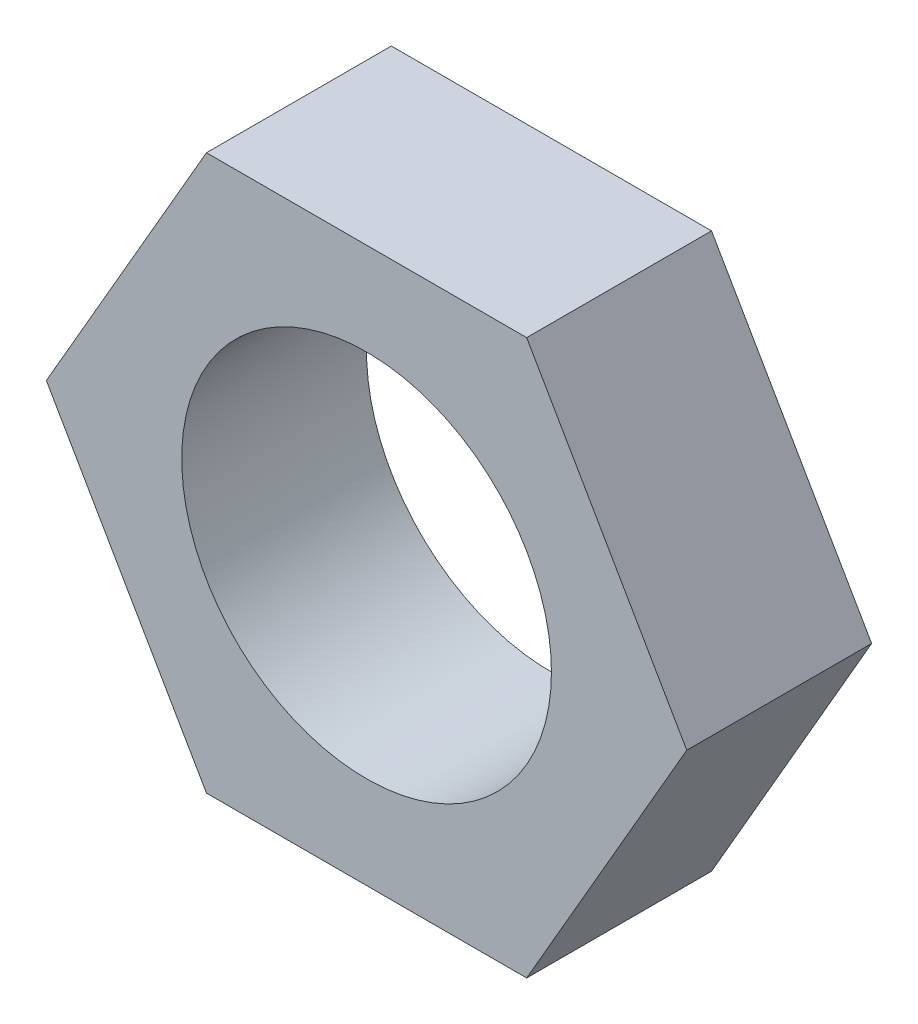
ISO-10303-21;
HEADER;
FILE_DESCRIPTION(('STEP AP214'),'2;1');
FILE_NAME('part.step','',(''),(''),'','','');
FILE_SCHEMA(('AUTOMOTIVE_DESIGN { 1 0 10303 214 1 1 1 1 }'));
ENDSEC;
DATA;
#1=APPLICATION_CONTEXT('core data for automotive mechanical design processes');
#2=APPLICATION_PROTOCOL_DEFINITION('international standard','automotive_design',2000,#1);
#3=PRODUCT_CONTEXT('',#1,'mechanical');
#4=PRODUCT('Part','Part','',(#3));
#5=PRODUCT_RELATED_PRODUCT_CATEGORY('part','',(#4));
#6=PRODUCT_DEFINITION_FORMATION('','',#4);
#7=PRODUCT_DEFINITION_CONTEXT('part definition',#1,'design');
#8=PRODUCT_DEFINITION('design','',#6,#7);
#9=PRODUCT_DEFINITION_SHAPE('','',#8);
#10=(LENGTH_UNIT() NAMED_UNIT(*) SI_UNIT(.MILLI.,.METRE.));
#11=(NAMED_UNIT(*) PLANE_ANGLE_UNIT() SI_UNIT($,.RADIAN.));
#12=(NAMED_UNIT(*) SI_UNIT($,.STERADIAN.) SOLID_ANGLE_UNIT());
#13=UNCERTAINTY_MEASURE_WITH_UNIT(LENGTH_MEASURE(1.E-05),#10,'distance_accuracy_value','');
#14=(GEOMETRIC_REPRESENTATION_CONTEXT(3) GLOBAL_UNCERTAINTY_ASSIGNED_CONTEXT((#13)) GLOBAL_UNIT_ASSIGNED_CONTEXT((#10,
#11,#12)) REPRESENTATION_CONTEXT('',''));
#15=CARTESIAN_POINT('',(0.,0.,0.));
#16=DIRECTION('',(0.,0.,1.));
#17=DIRECTION('',(1.,0.,0.));
#18=AXIS2_PLACEMENT_3D('',#15,#16,#17);
#19=CARTESIAN_POINT('',(-4.3301270189222,-7.5,5.));
#20=DIRECTION('',(0.,1.,0.));
#21=DIRECTION('',(0.,0.,1.));
#22=AXIS2_PLACEMENT_3D('',#19,#20,#21);
#23=PLANE('',#22);
#24=DIRECTION('',(1.,0.,0.));
#25=VECTOR('',#24,1.);
#26=CARTESIAN_POINT('',(-4.3301270189222,-7.5,0.));
#27=LINE('',#26,#25);
#28=CARTESIAN_POINT('',(-4.3301270189222,-7.5,0.));
#29=VERTEX_POINT('',#28);
#30=CARTESIAN_POINT('',(4.33012701892218,-7.5,0.));
#31=VERTEX_POINT('',#30);
#32=EDGE_CURVE('E118',#29,#31,#27,.T.);
#33=ORIENTED_EDGE('',*,*,#32,.T.);
#34=DIRECTION('',(0.,0.,-1.));
#35=VECTOR('',#34,1.);
#36=CARTESIAN_POINT('',(4.33012701892218,-7.5,5.));
#37=LINE('',#36,#35);
#38=CARTESIAN_POINT('',(4.33012701892218,-7.5,5.));
#39=VERTEX_POINT('',#38);
#40=EDGE_CURVE('E11',#39,#31,#37,.T.);
#41=ORIENTED_EDGE('',*,*,#40,.F.);
#42=DIRECTION('',(1.,0.,0.));
#43=VECTOR('',#42,1.);
#44=CARTESIAN_POINT('',(-4.3301270189222,-7.5,5.));
#45=LINE('',#44,#43);
#46=CARTESIAN_POINT('',(-4.3301270189222,-7.5,5.));
#47=VERTEX_POINT('',#46);
#48=EDGE_CURVE('E129',#47,#39,#45,.T.);
#49=ORIENTED_EDGE('',*,*,#48,.F.);
#50=DIRECTION('',(0.,0.,-1.));
#51=VECTOR('',#50,1.);
#52=CARTESIAN_POINT('',(-4.3301270189222,-7.5,5.));
#53=LINE('',#52,#51);
#54=EDGE_CURVE('E114',#47,#29,#53,.T.);
#55=ORIENTED_EDGE('',*,*,#54,.T.);
#56=EDGE_LOOP('',(#33,#41,#49,#55));
#57=FACE_BOUND('',#56,.T.);
#58=ADVANCED_FACE('F34',(#57),#23,.F.);
#59=CARTESIAN_POINT('',(4.33012701892218,-7.5,5.));
#60=DIRECTION('',(-0.866025403784438,0.5,0.));
#61=DIRECTION('',(-0.5,-0.866025403784438,0.));
#62=AXIS2_PLACEMENT_3D('',#59,#60,#61);
#63=PLANE('',#62);
#64=DIRECTION('',(0.5,0.866025403784438,0.));
#65=VECTOR('',#64,1.);
#66=CARTESIAN_POINT('',(4.33012701892218,-7.5,0.));
#67=LINE('',#66,#65);
#68=CARTESIAN_POINT('',(8.66025403784437,0.,0.));
#69=VERTEX_POINT('',#68);
#70=EDGE_CURVE('E121',#31,#69,#67,.T.);
#71=ORIENTED_EDGE('',*,*,#70,.T.);
#72=DIRECTION('',(0.,0.,-1.));
#73=VECTOR('',#72,1.);
#74=CARTESIAN_POINT('',(8.66025403784437,0.,5.));
#75=LINE('',#74,#73);
#76=CARTESIAN_POINT('',(8.66025403784437,0.,5.));
#77=VERTEX_POINT('',#76);
#78=EDGE_CURVE('E42',#77,#69,#75,.T.);
#79=ORIENTED_EDGE('',*,*,#78,.F.);
#80=DIRECTION('',(0.5,0.866025403784438,0.));
#81=VECTOR('',#80,1.);
#82=CARTESIAN_POINT('',(4.33012701892218,-7.5,5.));
#83=LINE('',#82,#81);
#84=EDGE_CURVE('E87',#39,#77,#83,.T.);
#85=ORIENTED_EDGE('',*,*,#84,.F.);
#86=ORIENTED_EDGE('',*,*,#40,.T.);
#87=EDGE_LOOP('',(#71,#79,#85,#86));
#88=FACE_BOUND('',#87,.T.);
#89=ADVANCED_FACE('F154',(#88),#63,.F.);
#90=CARTESIAN_POINT('',(8.66025403784437,0.,5.));
#91=DIRECTION('',(-0.866025403784438,-0.500000000000001,0.));
#92=DIRECTION('',(0.500000000000001,-0.866025403784438,0.));
#93=AXIS2_PLACEMENT_3D('',#90,#91,#92);
#94=PLANE('',#93);
#95=DIRECTION('',(-0.500000000000001,0.866025403784438,0.));
#96=VECTOR('',#95,1.);
#97=CARTESIAN_POINT('',(8.66025403784437,0.,0.));
#98=LINE('',#97,#96);
#99=CARTESIAN_POINT('',(4.33012701892217,7.50000000000001,0.));
#100=VERTEX_POINT('',#99);
#101=EDGE_CURVE('E124',#69,#100,#98,.T.);
#102=ORIENTED_EDGE('',*,*,#101,.T.);
#103=DIRECTION('',(0.,0.,-1.));
#104=VECTOR('',#103,1.);
#105=CARTESIAN_POINT('',(4.33012701892217,7.50000000000001,5.));
#106=LINE('',#105,#104);
#107=CARTESIAN_POINT('',(4.33012701892217,7.50000000000001,5.));
#108=VERTEX_POINT('',#107);
#109=EDGE_CURVE('E109',#108,#100,#106,.T.);
#110=ORIENTED_EDGE('',*,*,#109,.F.);
#111=DIRECTION('',(-0.500000000000001,0.866025403784438,0.));
#112=VECTOR('',#111,1.);
#113=CARTESIAN_POINT('',(8.66025403784437,0.,5.));
#114=LINE('',#113,#112);
#115=EDGE_CURVE('E100',#77,#108,#114,.T.);
#116=ORIENTED_EDGE('',*,*,#115,.F.);
#117=ORIENTED_EDGE('',*,*,#78,.T.);
#118=EDGE_LOOP('',(#102,#110,#116,#117));
#119=FACE_BOUND('',#118,.T.);
#120=ADVANCED_FACE('F135',(#119),#94,.F.);
#121=CARTESIAN_POINT('',(4.33012701892217,7.50000000000001,5.));
#122=DIRECTION('',(0.,-1.,0.));
#123=DIRECTION('',(0.,0.,-1.));
#124=AXIS2_PLACEMENT_3D('',#121,#122,#123);
#125=PLANE('',#124);
#126=DIRECTION('',(-1.,0.,0.));
#127=VECTOR('',#126,1.);
#128=CARTESIAN_POINT('',(4.33012701892217,7.50000000000001,0.));
#129=LINE('',#128,#127);
#130=CARTESIAN_POINT('',(-4.3301270189222,7.50000000000001,0.));
#131=VERTEX_POINT('',#130);
#132=EDGE_CURVE('E108',#100,#131,#129,.T.);
#133=ORIENTED_EDGE('',*,*,#132,.T.);
#134=DIRECTION('',(0.,0.,-1.));
#135=VECTOR('',#134,1.);
#136=CARTESIAN_POINT('',(-4.3301270189222,7.50000000000001,5.));
#137=LINE('',#136,#135);
#138=CARTESIAN_POINT('',(-4.3301270189222,7.50000000000001,5.));
#139=VERTEX_POINT('',#138);
#140=EDGE_CURVE('E105',#139,#131,#137,.T.);
#141=ORIENTED_EDGE('',*,*,#140,.F.);
#142=DIRECTION('',(-1.,0.,0.));
#143=VECTOR('',#142,1.);
#144=CARTESIAN_POINT('',(4.33012701892217,7.50000000000001,5.));
#145=LINE('',#144,#143);
#146=EDGE_CURVE('E94',#108,#139,#145,.T.);
#147=ORIENTED_EDGE('',*,*,#146,.F.);
#148=ORIENTED_EDGE('',*,*,#109,.T.);
#149=EDGE_LOOP('',(#133,#141,#147,#148));
#150=FACE_BOUND('',#149,.T.);
#151=ADVANCED_FACE('F106',(#150),#125,.F.);
#152=CARTESIAN_POINT('',(-4.3301270189222,7.50000000000001,5.));
#153=DIRECTION('',(0.866025403784438,-0.5,0.));
#154=DIRECTION('',(0.5,0.866025403784439,0.));
#155=AXIS2_PLACEMENT_3D('',#152,#153,#154);
#156=PLANE('',#155);
#157=DIRECTION('',(-0.5,-0.866025403784439,0.));
#158=VECTOR('',#157,1.);
#159=CARTESIAN_POINT('',(-4.3301270189222,7.50000000000001,0.));
#160=LINE('',#159,#158);
#161=CARTESIAN_POINT('',(-8.6602540378444,0.,0.));
#162=VERTEX_POINT('',#161);
#163=EDGE_CURVE('E73',#131,#162,#160,.T.);
#164=ORIENTED_EDGE('',*,*,#163,.T.);
#165=DIRECTION('',(0.,0.,-1.));
#166=VECTOR('',#165,1.);
#167=CARTESIAN_POINT('',(-8.6602540378444,0.,5.));
#168=LINE('',#167,#166);
#169=CARTESIAN_POINT('',(-8.6602540378444,0.,5.));
#170=VERTEX_POINT('',#169);
#171=EDGE_CURVE('E110',#170,#162,#168,.T.);
#172=ORIENTED_EDGE('',*,*,#171,.F.);
#173=DIRECTION('',(-0.5,-0.866025403784439,0.));
#174=VECTOR('',#173,1.);
#175=CARTESIAN_POINT('',(-4.3301270189222,7.50000000000001,5.));
#176=LINE('',#175,#174);
#177=EDGE_CURVE('E98',#139,#170,#176,.T.);
#178=ORIENTED_EDGE('',*,*,#177,.F.);
#179=ORIENTED_EDGE('',*,*,#140,.T.);
#180=EDGE_LOOP('',(#164,#172,#178,#179));
#181=FACE_BOUND('',#180,.T.);
#182=ADVANCED_FACE('F112',(#181),#156,.F.);
#183=CARTESIAN_POINT('',(-8.6602540378444,0.,5.));
#184=DIRECTION('',(0.866025403784438,0.5,0.));
#185=DIRECTION('',(-0.5,0.866025403784438,0.));
#186=AXIS2_PLACEMENT_3D('',#183,#184,#185);
#187=PLANE('',#186);
#188=DIRECTION('',(0.5,-0.866025403784439,0.));
#189=VECTOR('',#188,1.);
#190=CARTESIAN_POINT('',(-8.6602540378444,0.,0.));
#191=LINE('',#190,#189);
#192=EDGE_CURVE('E79',#162,#29,#191,.T.);
#193=ORIENTED_EDGE('',*,*,#192,.T.);
#194=ORIENTED_EDGE('',*,*,#54,.F.);
#195=DIRECTION('',(0.5,-0.866025403784439,0.));
#196=VECTOR('',#195,1.);
#197=CARTESIAN_POINT('',(-8.6602540378444,0.,5.));
#198=LINE('',#197,#196);
#199=EDGE_CURVE('E50',#170,#47,#198,.T.);
#200=ORIENTED_EDGE('',*,*,#199,.F.);
#201=ORIENTED_EDGE('',*,*,#171,.T.);
#202=EDGE_LOOP('',(#193,#194,#200,#201));
#203=FACE_BOUND('',#202,.T.);
#204=ADVANCED_FACE('F142',(#203),#187,.F.);
#205=CARTESIAN_POINT('',(0.,0.,5.));
#206=DIRECTION('',(0.,0.,1.));
#207=DIRECTION('',(1.,0.,0.));
#208=AXIS2_PLACEMENT_3D('',#205,#206,#207);
#209=PLANE('',#208);
#210=CARTESIAN_POINT('',(0.,0.,5.));
#211=DIRECTION('',(0.,0.,1.));
#212=DIRECTION('',(1.,0.,0.));
#213=AXIS2_PLACEMENT_3D('',#210,#211,#212);
#214=CIRCLE('',#213,5.);
#215=CARTESIAN_POINT('',(5.,0.,5.));
#216=VERTEX_POINT('',#215);
#217=EDGE_CURVE('E209',#216,#216,#214,.T.);
#218=ORIENTED_EDGE('',*,*,#217,.F.);
#219=EDGE_LOOP('',(#218));
#220=FACE_BOUND('',#219,.T.);
#221=ORIENTED_EDGE('',*,*,#48,.T.);
#222=ORIENTED_EDGE('',*,*,#84,.T.);
#223=ORIENTED_EDGE('',*,*,#115,.T.);
#224=ORIENTED_EDGE('',*,*,#146,.T.);
#225=ORIENTED_EDGE('',*,*,#177,.T.);
#226=ORIENTED_EDGE('',*,*,#199,.T.);
#227=EDGE_LOOP('',(#221,#222,#223,#224,#225,#226));
#228=FACE_BOUND('',#227,.T.);
#229=ADVANCED_FACE('F96',(#220,#228),#209,.T.);
#230=CARTESIAN_POINT('',(0.,0.,0.));
#231=DIRECTION('',(0.,0.,1.));
#232=DIRECTION('',(1.,0.,0.));
#233=AXIS2_PLACEMENT_3D('',#230,#231,#232);
#234=PLANE('',#233);
#235=CARTESIAN_POINT('',(0.,0.,0.));
#236=DIRECTION('',(0.,0.,1.));
#237=DIRECTION('',(1.,0.,0.));
#238=AXIS2_PLACEMENT_3D('',#235,#236,#237);
#239=CIRCLE('',#238,5.);
#240=CARTESIAN_POINT('',(5.,0.,0.));
#241=VERTEX_POINT('',#240);
#242=EDGE_CURVE('E122',#241,#241,#239,.T.);
#243=ORIENTED_EDGE('',*,*,#242,.T.);
#244=EDGE_LOOP('',(#243));
#245=FACE_BOUND('',#244,.T.);
#246=ORIENTED_EDGE('',*,*,#32,.F.);
#247=ORIENTED_EDGE('',*,*,#192,.F.);
#248=ORIENTED_EDGE('',*,*,#163,.F.);
#249=ORIENTED_EDGE('',*,*,#132,.F.);
#250=ORIENTED_EDGE('',*,*,#101,.F.);
#251=ORIENTED_EDGE('',*,*,#70,.F.);
#252=EDGE_LOOP('',(#246,#247,#248,#249,#250,#251));
#253=FACE_BOUND('',#252,.T.);
#254=ADVANCED_FACE('F138',(#245,#253),#234,.F.);
#255=CARTESIAN_POINT('',(0.,0.,0.));
#256=DIRECTION('',(0.,0.,1.));
#257=DIRECTION('',(1.,0.,0.));
#258=AXIS2_PLACEMENT_3D('',#255,#256,#257);
#259=CYLINDRICAL_SURFACE('',#258,5.);
#260=ORIENTED_EDGE('',*,*,#242,.F.);
#261=EDGE_LOOP('',(#260));
#262=FACE_BOUND('',#261,.T.);
#263=ORIENTED_EDGE('',*,*,#217,.T.);
#264=EDGE_LOOP('',(#263));
#265=FACE_BOUND('',#264,.T.);
#266=ADVANCED_FACE('F191',(#262,#265),#259,.F.);
#267=CLOSED_SHELL('',(#58,#89,#120,#151,#182,#204,#229,#254,#266));
#268=MANIFOLD_SOLID_BREP('B2',#267);
#269=ADVANCED_BREP_SHAPE_REPRESENTATION('',(#18,#268),#14);
#270=SHAPE_DEFINITION_REPRESENTATION(#9,#269);
ENDSEC;
END-ISO-10303-21;
